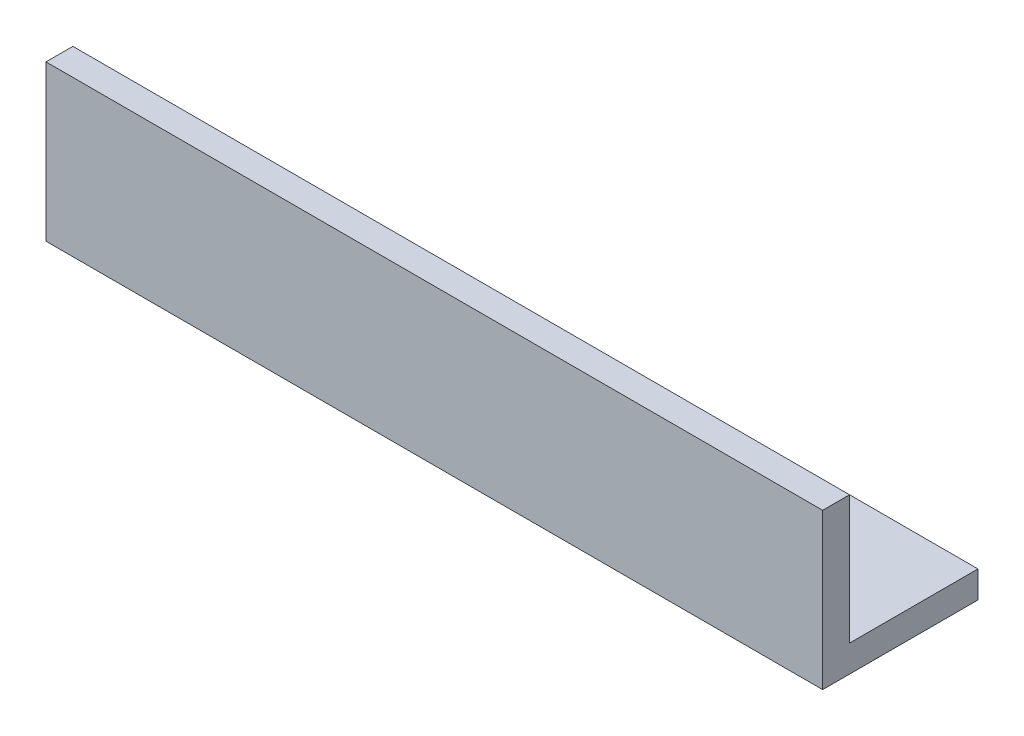
ISO-10303-21;
HEADER;
FILE_DESCRIPTION(('STEP AP214'),'2;1');
FILE_NAME('part.step','',(''),(''),'','','');
FILE_SCHEMA(('AUTOMOTIVE_DESIGN { 1 0 10303 214 1 1 1 1 }'));
ENDSEC;
DATA;
#1=APPLICATION_CONTEXT('core data for automotive mechanical design processes');
#2=APPLICATION_PROTOCOL_DEFINITION('international standard','automotive_design',2000,#1);
#3=PRODUCT_CONTEXT('',#1,'mechanical');
#4=PRODUCT('Part','Part','',(#3));
#5=PRODUCT_RELATED_PRODUCT_CATEGORY('part','',(#4));
#6=PRODUCT_DEFINITION_FORMATION('','',#4);
#7=PRODUCT_DEFINITION_CONTEXT('part definition',#1,'design');
#8=PRODUCT_DEFINITION('design','',#6,#7);
#9=PRODUCT_DEFINITION_SHAPE('','',#8);
#10=(LENGTH_UNIT() NAMED_UNIT(*) SI_UNIT(.MILLI.,.METRE.));
#11=(NAMED_UNIT(*) PLANE_ANGLE_UNIT() SI_UNIT($,.RADIAN.));
#12=(NAMED_UNIT(*) SI_UNIT($,.STERADIAN.) SOLID_ANGLE_UNIT());
#13=UNCERTAINTY_MEASURE_WITH_UNIT(LENGTH_MEASURE(1.E-05),#10,'distance_accuracy_value','');
#14=(GEOMETRIC_REPRESENTATION_CONTEXT(3) GLOBAL_UNCERTAINTY_ASSIGNED_CONTEXT((#13)) GLOBAL_UNIT_ASSIGNED_CONTEXT((#10,
#11,#12)) REPRESENTATION_CONTEXT('',''));
#15=CARTESIAN_POINT('',(0.,0.,0.));
#16=DIRECTION('',(0.,0.,1.));
#17=DIRECTION('',(1.,0.,0.));
#18=AXIS2_PLACEMENT_3D('',#15,#16,#17);
#19=CARTESIAN_POINT('',(100.,20.,0.));
#20=DIRECTION('',(0.,0.,-1.));
#21=DIRECTION('',(0.,1.,0.));
#22=AXIS2_PLACEMENT_3D('',#19,#20,#21);
#23=PLANE('',#22);
#24=DIRECTION('',(0.,-1.,0.));
#25=VECTOR('',#24,1.);
#26=CARTESIAN_POINT('',(0.,20.,0.));
#27=LINE('',#26,#25);
#28=CARTESIAN_POINT('',(0.,20.,0.));
#29=VERTEX_POINT('',#28);
#30=CARTESIAN_POINT('',(0.,0.,0.));
#31=VERTEX_POINT('',#30);
#32=EDGE_CURVE('E121',#29,#31,#27,.T.);
#33=ORIENTED_EDGE('',*,*,#32,.T.);
#34=DIRECTION('',(-1.,0.,0.));
#35=VECTOR('',#34,1.);
#36=CARTESIAN_POINT('',(100.,0.,0.));
#37=LINE('',#36,#35);
#38=CARTESIAN_POINT('',(100.,0.,0.));
#39=VERTEX_POINT('',#38);
#40=EDGE_CURVE('E11',#39,#31,#37,.T.);
#41=ORIENTED_EDGE('',*,*,#40,.F.);
#42=DIRECTION('',(0.,-1.,0.));
#43=VECTOR('',#42,1.);
#44=CARTESIAN_POINT('',(100.,20.,0.));
#45=LINE('',#44,#43);
#46=CARTESIAN_POINT('',(100.,20.,0.));
#47=VERTEX_POINT('',#46);
#48=EDGE_CURVE('E131',#47,#39,#45,.T.);
#49=ORIENTED_EDGE('',*,*,#48,.F.);
#50=DIRECTION('',(-1.,0.,0.));
#51=VECTOR('',#50,1.);
#52=CARTESIAN_POINT('',(100.,20.,0.));
#53=LINE('',#52,#51);
#54=EDGE_CURVE('E117',#47,#29,#53,.T.);
#55=ORIENTED_EDGE('',*,*,#54,.T.);
#56=EDGE_LOOP('',(#33,#41,#49,#55));
#57=FACE_BOUND('',#56,.T.);
#58=ADVANCED_FACE('F37',(#57),#23,.F.);
#59=CARTESIAN_POINT('',(100.,0.,0.));
#60=DIRECTION('',(0.,1.,0.));
#61=DIRECTION('',(0.,0.,1.));
#62=AXIS2_PLACEMENT_3D('',#59,#60,#61);
#63=PLANE('',#62);
#64=DIRECTION('',(0.,0.,-1.));
#65=VECTOR('',#64,1.);
#66=CARTESIAN_POINT('',(0.,0.,0.));
#67=LINE('',#66,#65);
#68=CARTESIAN_POINT('',(0.,0.,-20.));
#69=VERTEX_POINT('',#68);
#70=EDGE_CURVE('E124',#31,#69,#67,.T.);
#71=ORIENTED_EDGE('',*,*,#70,.T.);
#72=DIRECTION('',(-1.,0.,0.));
#73=VECTOR('',#72,1.);
#74=CARTESIAN_POINT('',(100.,0.,-20.));
#75=LINE('',#74,#73);
#76=CARTESIAN_POINT('',(100.,0.,-20.));
#77=VERTEX_POINT('',#76);
#78=EDGE_CURVE('E45',#77,#69,#75,.T.);
#79=ORIENTED_EDGE('',*,*,#78,.F.);
#80=DIRECTION('',(0.,0.,-1.));
#81=VECTOR('',#80,1.);
#82=CARTESIAN_POINT('',(100.,0.,0.));
#83=LINE('',#82,#81);
#84=EDGE_CURVE('E90',#39,#77,#83,.T.);
#85=ORIENTED_EDGE('',*,*,#84,.F.);
#86=ORIENTED_EDGE('',*,*,#40,.T.);
#87=EDGE_LOOP('',(#71,#79,#85,#86));
#88=FACE_BOUND('',#87,.T.);
#89=ADVANCED_FACE('F155',(#88),#63,.F.);
#90=CARTESIAN_POINT('',(100.,0.,-20.));
#91=DIRECTION('',(0.,0.,1.));
#92=DIRECTION('',(1.,0.,0.));
#93=AXIS2_PLACEMENT_3D('',#90,#91,#92);
#94=PLANE('',#93);
#95=DIRECTION('',(0.,1.,0.));
#96=VECTOR('',#95,1.);
#97=CARTESIAN_POINT('',(0.,0.,-20.));
#98=LINE('',#97,#96);
#99=CARTESIAN_POINT('',(0.,3.46117846701572,-20.));
#100=VERTEX_POINT('',#99);
#101=EDGE_CURVE('E126',#69,#100,#98,.T.);
#102=ORIENTED_EDGE('',*,*,#101,.T.);
#103=DIRECTION('',(-1.,0.,0.));
#104=VECTOR('',#103,1.);
#105=CARTESIAN_POINT('',(100.,3.46117846701572,-20.));
#106=LINE('',#105,#104);
#107=CARTESIAN_POINT('',(100.,3.46117846701572,-20.));
#108=VERTEX_POINT('',#107);
#109=EDGE_CURVE('E112',#108,#100,#106,.T.);
#110=ORIENTED_EDGE('',*,*,#109,.F.);
#111=DIRECTION('',(0.,1.,0.));
#112=VECTOR('',#111,1.);
#113=CARTESIAN_POINT('',(100.,0.,-20.));
#114=LINE('',#113,#112);
#115=EDGE_CURVE('E103',#77,#108,#114,.T.);
#116=ORIENTED_EDGE('',*,*,#115,.F.);
#117=ORIENTED_EDGE('',*,*,#78,.T.);
#118=EDGE_LOOP('',(#102,#110,#116,#117));
#119=FACE_BOUND('',#118,.T.);
#120=ADVANCED_FACE('F137',(#119),#94,.F.);
#121=CARTESIAN_POINT('',(100.,3.46117846701572,-20.));
#122=DIRECTION('',(0.,-1.,0.));
#123=DIRECTION('',(0.,0.,-1.));
#124=AXIS2_PLACEMENT_3D('',#121,#122,#123);
#125=PLANE('',#124);
#126=DIRECTION('',(0.,0.,1.));
#127=VECTOR('',#126,1.);
#128=CARTESIAN_POINT('',(0.,3.46117846701572,-20.));
#129=LINE('',#128,#127);
#130=CARTESIAN_POINT('',(0.,3.46117846701572,-3.46117846701572));
#131=VERTEX_POINT('',#130);
#132=EDGE_CURVE('E111',#100,#131,#129,.T.);
#133=ORIENTED_EDGE('',*,*,#132,.T.);
#134=DIRECTION('',(-1.,0.,0.));
#135=VECTOR('',#134,1.);
#136=CARTESIAN_POINT('',(100.,3.46117846701572,-3.46117846701572));
#137=LINE('',#136,#135);
#138=CARTESIAN_POINT('',(100.,3.46117846701572,-3.46117846701572));
#139=VERTEX_POINT('',#138);
#140=EDGE_CURVE('E108',#139,#131,#137,.T.);
#141=ORIENTED_EDGE('',*,*,#140,.F.);
#142=DIRECTION('',(0.,0.,1.));
#143=VECTOR('',#142,1.);
#144=CARTESIAN_POINT('',(100.,3.46117846701572,-20.));
#145=LINE('',#144,#143);
#146=EDGE_CURVE('E97',#108,#139,#145,.T.);
#147=ORIENTED_EDGE('',*,*,#146,.F.);
#148=ORIENTED_EDGE('',*,*,#109,.T.);
#149=EDGE_LOOP('',(#133,#141,#147,#148));
#150=FACE_BOUND('',#149,.T.);
#151=ADVANCED_FACE('F109',(#150),#125,.F.);
#152=CARTESIAN_POINT('',(100.,3.46117846701572,-3.46117846701572));
#153=DIRECTION('',(0.,0.,1.));
#154=DIRECTION('',(1.,0.,0.));
#155=AXIS2_PLACEMENT_3D('',#152,#153,#154);
#156=PLANE('',#155);
#157=DIRECTION('',(0.,1.,0.));
#158=VECTOR('',#157,1.);
#159=CARTESIAN_POINT('',(0.,3.46117846701572,-3.46117846701572));
#160=LINE('',#159,#158);
#161=CARTESIAN_POINT('',(0.,20.,-3.46117846701572));
#162=VERTEX_POINT('',#161);
#163=EDGE_CURVE('E76',#131,#162,#160,.T.);
#164=ORIENTED_EDGE('',*,*,#163,.T.);
#165=DIRECTION('',(-1.,0.,0.));
#166=VECTOR('',#165,1.);
#167=CARTESIAN_POINT('',(100.,20.,-3.46117846701572));
#168=LINE('',#167,#166);
#169=CARTESIAN_POINT('',(100.,20.,-3.46117846701572));
#170=VERTEX_POINT('',#169);
#171=EDGE_CURVE('E113',#170,#162,#168,.T.);
#172=ORIENTED_EDGE('',*,*,#171,.F.);
#173=DIRECTION('',(0.,1.,0.));
#174=VECTOR('',#173,1.);
#175=CARTESIAN_POINT('',(100.,3.46117846701572,-3.46117846701572));
#176=LINE('',#175,#174);
#177=EDGE_CURVE('E101',#139,#170,#176,.T.);
#178=ORIENTED_EDGE('',*,*,#177,.F.);
#179=ORIENTED_EDGE('',*,*,#140,.T.);
#180=EDGE_LOOP('',(#164,#172,#178,#179));
#181=FACE_BOUND('',#180,.T.);
#182=ADVANCED_FACE('F115',(#181),#156,.F.);
#183=CARTESIAN_POINT('',(100.,20.,-3.46117846701572));
#184=DIRECTION('',(0.,-1.,0.));
#185=DIRECTION('',(0.,0.,-1.));
#186=AXIS2_PLACEMENT_3D('',#183,#184,#185);
#187=PLANE('',#186);
#188=DIRECTION('',(0.,0.,1.));
#189=VECTOR('',#188,1.);
#190=CARTESIAN_POINT('',(0.,20.,-3.46117846701572));
#191=LINE('',#190,#189);
#192=EDGE_CURVE('E82',#162,#29,#191,.T.);
#193=ORIENTED_EDGE('',*,*,#192,.T.);
#194=ORIENTED_EDGE('',*,*,#54,.F.);
#195=DIRECTION('',(0.,0.,1.));
#196=VECTOR('',#195,1.);
#197=CARTESIAN_POINT('',(100.,20.,-3.46117846701572));
#198=LINE('',#197,#196);
#199=EDGE_CURVE('E53',#170,#47,#198,.T.);
#200=ORIENTED_EDGE('',*,*,#199,.F.);
#201=ORIENTED_EDGE('',*,*,#171,.T.);
#202=EDGE_LOOP('',(#193,#194,#200,#201));
#203=FACE_BOUND('',#202,.T.);
#204=ADVANCED_FACE('F144',(#203),#187,.F.);
#205=CARTESIAN_POINT('',(100.,0.,0.));
#206=DIRECTION('',(1.,0.,0.));
#207=DIRECTION('',(0.,0.,-1.));
#208=AXIS2_PLACEMENT_3D('',#205,#206,#207);
#209=PLANE('',#208);
#210=ORIENTED_EDGE('',*,*,#48,.T.);
#211=ORIENTED_EDGE('',*,*,#84,.T.);
#212=ORIENTED_EDGE('',*,*,#115,.T.);
#213=ORIENTED_EDGE('',*,*,#146,.T.);
#214=ORIENTED_EDGE('',*,*,#177,.T.);
#215=ORIENTED_EDGE('',*,*,#199,.T.);
#216=EDGE_LOOP('',(#210,#211,#212,#213,#214,#215));
#217=FACE_BOUND('',#216,.T.);
#218=ADVANCED_FACE('F99',(#217),#209,.T.);
#219=CARTESIAN_POINT('',(0.,0.,0.));
#220=DIRECTION('',(1.,0.,0.));
#221=DIRECTION('',(0.,0.,-1.));
#222=AXIS2_PLACEMENT_3D('',#219,#220,#221);
#223=PLANE('',#222);
#224=ORIENTED_EDGE('',*,*,#32,.F.);
#225=ORIENTED_EDGE('',*,*,#192,.F.);
#226=ORIENTED_EDGE('',*,*,#163,.F.);
#227=ORIENTED_EDGE('',*,*,#132,.F.);
#228=ORIENTED_EDGE('',*,*,#101,.F.);
#229=ORIENTED_EDGE('',*,*,#70,.F.);
#230=EDGE_LOOP('',(#224,#225,#226,#227,#228,#229));
#231=FACE_BOUND('',#230,.T.);
#232=ADVANCED_FACE('F140',(#231),#223,.F.);
#233=CLOSED_SHELL('',(#58,#89,#120,#151,#182,#204,#218,#232));
#234=MANIFOLD_SOLID_BREP('B2',#233);
#235=ADVANCED_BREP_SHAPE_REPRESENTATION('',(#18,#234),#14);
#236=SHAPE_DEFINITION_REPRESENTATION(#9,#235);
ENDSEC;
END-ISO-10303-21;
